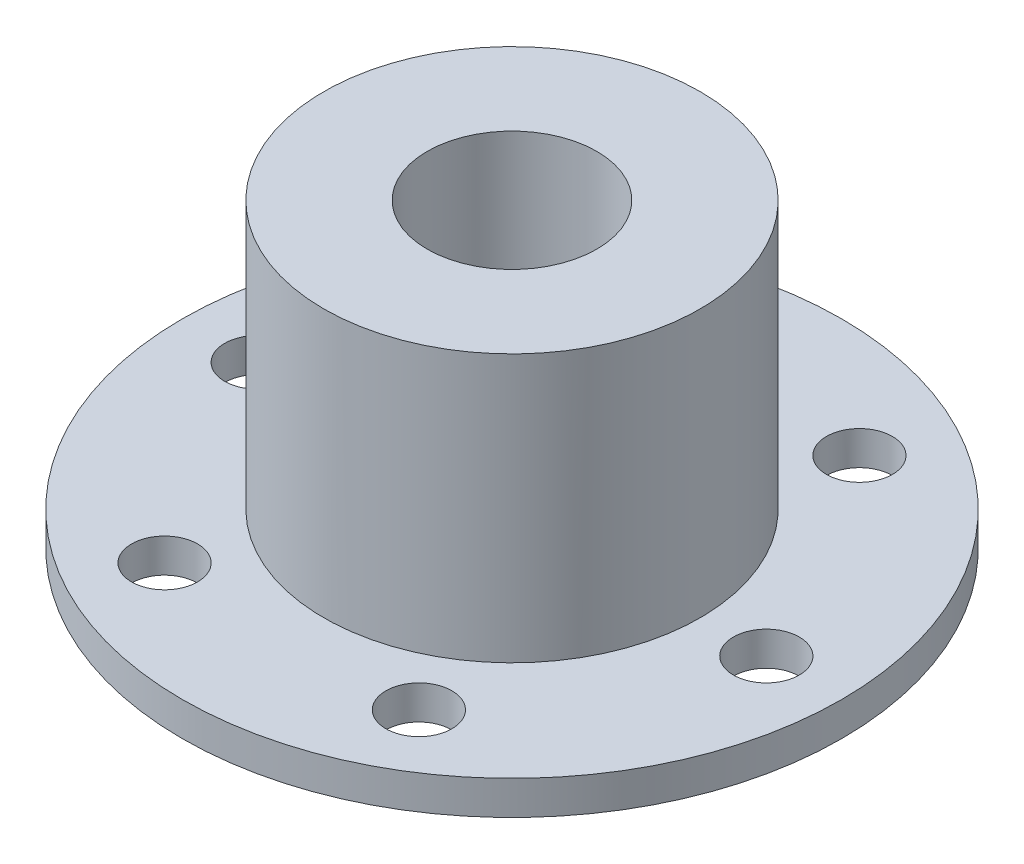
ISO-10303-21;
HEADER;
FILE_DESCRIPTION(('STEP AP214'),'2;1');
FILE_NAME('part.step','',(''),(''),'','','');
FILE_SCHEMA(('AUTOMOTIVE_DESIGN { 1 0 10303 214 1 1 1 1 }'));
ENDSEC;
DATA;
#1=APPLICATION_CONTEXT('core data for automotive mechanical design processes');
#2=APPLICATION_PROTOCOL_DEFINITION('international standard','automotive_design',2000,#1);
#3=PRODUCT_CONTEXT('',#1,'mechanical');
#4=PRODUCT('Part','Part','',(#3));
#5=PRODUCT_RELATED_PRODUCT_CATEGORY('part','',(#4));
#6=PRODUCT_DEFINITION_FORMATION('','',#4);
#7=PRODUCT_DEFINITION_CONTEXT('part definition',#1,'design');
#8=PRODUCT_DEFINITION('design','',#6,#7);
#9=PRODUCT_DEFINITION_SHAPE('','',#8);
#10=(LENGTH_UNIT() NAMED_UNIT(*) SI_UNIT(.MILLI.,.METRE.));
#11=(NAMED_UNIT(*) PLANE_ANGLE_UNIT() SI_UNIT($,.RADIAN.));
#12=(NAMED_UNIT(*) SI_UNIT($,.STERADIAN.) SOLID_ANGLE_UNIT());
#13=UNCERTAINTY_MEASURE_WITH_UNIT(LENGTH_MEASURE(1.E-05),#10,'distance_accuracy_value','');
#14=(GEOMETRIC_REPRESENTATION_CONTEXT(3) GLOBAL_UNCERTAINTY_ASSIGNED_CONTEXT((#13)) GLOBAL_UNIT_ASSIGNED_CONTEXT((#10,
#11,#12)) REPRESENTATION_CONTEXT('',''));
#15=CARTESIAN_POINT('',(0.,0.,0.));
#16=DIRECTION('',(0.,0.,1.));
#17=DIRECTION('',(1.,0.,0.));
#18=AXIS2_PLACEMENT_3D('',#15,#16,#17);
#19=CARTESIAN_POINT('',(0.,16.,0.));
#20=DIRECTION('',(0.,-1.,0.));
#21=DIRECTION('',(0.,0.,-1.));
#22=AXIS2_PLACEMENT_3D('',#19,#20,#21);
#23=CYLINDRICAL_SURFACE('',#22,9.99);
#24=CARTESIAN_POINT('',(0.,16.,0.));
#25=DIRECTION('',(0.,1.,0.));
#26=DIRECTION('',(0.,0.,1.));
#27=AXIS2_PLACEMENT_3D('',#24,#25,#26);
#28=CIRCLE('',#27,9.99);
#29=CARTESIAN_POINT('',(0.,16.,9.99));
#30=VERTEX_POINT('',#29);
#31=EDGE_CURVE('E49',#30,#30,#28,.T.);
#32=ORIENTED_EDGE('',*,*,#31,.F.);
#33=EDGE_LOOP('',(#32));
#34=FACE_BOUND('',#33,.T.);
#35=CARTESIAN_POINT('',(0.,1.8,0.));
#36=DIRECTION('',(0.,-1.,0.));
#37=DIRECTION('',(0.,0.,-1.));
#38=AXIS2_PLACEMENT_3D('',#35,#36,#37);
#39=CIRCLE('',#38,9.99);
#40=CARTESIAN_POINT('',(0.,1.8,-9.99));
#41=VERTEX_POINT('',#40);
#42=EDGE_CURVE('E10',#41,#41,#39,.T.);
#43=ORIENTED_EDGE('',*,*,#42,.F.);
#44=EDGE_LOOP('',(#43));
#45=FACE_BOUND('',#44,.T.);
#46=ADVANCED_FACE('F42',(#34,#45),#23,.T.);
#47=CARTESIAN_POINT('',(0.,16.,0.));
#48=DIRECTION('',(0.,1.,0.));
#49=DIRECTION('',(0.,0.,1.));
#50=AXIS2_PLACEMENT_3D('',#47,#48,#49);
#51=PLANE('',#50);
#52=CARTESIAN_POINT('',(0.,16.,0.));
#53=DIRECTION('',(0.,1.,0.));
#54=DIRECTION('',(0.,0.,1.));
#55=AXIS2_PLACEMENT_3D('',#52,#53,#54);
#56=CIRCLE('',#55,4.5);
#57=CARTESIAN_POINT('',(0.,16.,4.5));
#58=VERTEX_POINT('',#57);
#59=EDGE_CURVE('E64',#58,#58,#56,.F.);
#60=ORIENTED_EDGE('',*,*,#59,.T.);
#61=EDGE_LOOP('',(#60));
#62=FACE_BOUND('',#61,.T.);
#63=ORIENTED_EDGE('',*,*,#31,.T.);
#64=EDGE_LOOP('',(#63));
#65=FACE_BOUND('',#64,.T.);
#66=ADVANCED_FACE('F140',(#62,#65),#51,.T.);
#67=CARTESIAN_POINT('',(0.,1.8,0.));
#68=DIRECTION('',(0.,-1.,0.));
#69=DIRECTION('',(0.,0.,-1.));
#70=AXIS2_PLACEMENT_3D('',#67,#68,#69);
#71=CYLINDRICAL_SURFACE('',#70,17.5);
#72=CARTESIAN_POINT('',(0.,1.8,0.));
#73=DIRECTION('',(0.,-1.,0.));
#74=DIRECTION('',(0.,0.,-1.));
#75=AXIS2_PLACEMENT_3D('',#72,#73,#74);
#76=CIRCLE('',#75,17.5);
#77=CARTESIAN_POINT('',(0.,1.8,-17.5));
#78=VERTEX_POINT('',#77);
#79=EDGE_CURVE('E54',#78,#78,#76,.T.);
#80=ORIENTED_EDGE('',*,*,#79,.T.);
#81=EDGE_LOOP('',(#80));
#82=FACE_BOUND('',#81,.T.);
#83=CARTESIAN_POINT('',(0.,0.,0.));
#84=DIRECTION('',(0.,-1.,0.));
#85=DIRECTION('',(0.,0.,-1.));
#86=AXIS2_PLACEMENT_3D('',#83,#84,#85);
#87=CIRCLE('',#86,17.5);
#88=CARTESIAN_POINT('',(0.,0.,-17.5));
#89=VERTEX_POINT('',#88);
#90=EDGE_CURVE('E59',#89,#89,#87,.T.);
#91=ORIENTED_EDGE('',*,*,#90,.F.);
#92=EDGE_LOOP('',(#91));
#93=FACE_BOUND('',#92,.T.);
#94=ADVANCED_FACE('F138',(#82,#93),#71,.T.);
#95=CARTESIAN_POINT('',(0.,1.8,0.));
#96=DIRECTION('',(0.,-1.,0.));
#97=DIRECTION('',(0.,0.,-1.));
#98=AXIS2_PLACEMENT_3D('',#95,#96,#97);
#99=PLANE('',#98);
#100=CARTESIAN_POINT('',(6.75000000000014,1.8,11.6913429510898));
#101=DIRECTION('',(0.,-1.,0.));
#102=DIRECTION('',(0.,0.,-1.));
#103=AXIS2_PLACEMENT_3D('',#100,#101,#102);
#104=CIRCLE('',#103,1.75);
#105=CARTESIAN_POINT('',(6.75000000000014,1.8,9.94134295108984));
#106=VERTEX_POINT('',#105);
#107=EDGE_CURVE('E90',#106,#106,#104,.F.);
#108=ORIENTED_EDGE('',*,*,#107,.F.);
#109=EDGE_LOOP('',(#108));
#110=FACE_BOUND('',#109,.T.);
#111=CARTESIAN_POINT('',(-6.74999999999989,1.8,11.69134295109));
#112=DIRECTION('',(0.,-1.,0.));
#113=DIRECTION('',(0.,0.,-1.));
#114=AXIS2_PLACEMENT_3D('',#111,#112,#113);
#115=CIRCLE('',#114,1.75);
#116=CARTESIAN_POINT('',(-6.74999999999989,1.8,9.94134295108998));
#117=VERTEX_POINT('',#116);
#118=EDGE_CURVE('E99',#117,#117,#115,.F.);
#119=ORIENTED_EDGE('',*,*,#118,.F.);
#120=EDGE_LOOP('',(#119));
#121=FACE_BOUND('',#120,.T.);
#122=CARTESIAN_POINT('',(-13.5,1.8,0.));
#123=DIRECTION('',(0.,-1.,0.));
#124=DIRECTION('',(0.,0.,-1.));
#125=AXIS2_PLACEMENT_3D('',#122,#123,#124);
#126=CIRCLE('',#125,1.75);
#127=CARTESIAN_POINT('',(-13.5,1.8,-1.75));
#128=VERTEX_POINT('',#127);
#129=EDGE_CURVE('E107',#128,#128,#126,.F.);
#130=ORIENTED_EDGE('',*,*,#129,.F.);
#131=EDGE_LOOP('',(#130));
#132=FACE_BOUND('',#131,.T.);
#133=CARTESIAN_POINT('',(-6.75000000000006,1.8,-11.6913429510899));
#134=DIRECTION('',(0.,-1.,0.));
#135=DIRECTION('',(0.,0.,-1.));
#136=AXIS2_PLACEMENT_3D('',#133,#134,#135);
#137=CIRCLE('',#136,1.75);
#138=CARTESIAN_POINT('',(-6.75000000000006,1.8,-13.4413429510899));
#139=VERTEX_POINT('',#138);
#140=EDGE_CURVE('E89',#139,#139,#137,.F.);
#141=ORIENTED_EDGE('',*,*,#140,.F.);
#142=EDGE_LOOP('',(#141));
#143=FACE_BOUND('',#142,.T.);
#144=CARTESIAN_POINT('',(6.74999999999997,1.8,-11.6913429510899));
#145=DIRECTION('',(0.,-1.,0.));
#146=DIRECTION('',(0.,0.,-1.));
#147=AXIS2_PLACEMENT_3D('',#144,#145,#146);
#148=CIRCLE('',#147,1.75);
#149=CARTESIAN_POINT('',(6.74999999999997,1.8,-13.4413429510899));
#150=VERTEX_POINT('',#149);
#151=EDGE_CURVE('E81',#150,#150,#148,.F.);
#152=ORIENTED_EDGE('',*,*,#151,.F.);
#153=EDGE_LOOP('',(#152));
#154=FACE_BOUND('',#153,.T.);
#155=CARTESIAN_POINT('',(13.5,1.8,0.));
#156=DIRECTION('',(0.,-1.,0.));
#157=DIRECTION('',(0.,0.,-1.));
#158=AXIS2_PLACEMENT_3D('',#155,#156,#157);
#159=CIRCLE('',#158,1.75);
#160=CARTESIAN_POINT('',(13.5,1.8,-1.75));
#161=VERTEX_POINT('',#160);
#162=EDGE_CURVE('E73',#161,#161,#159,.F.);
#163=ORIENTED_EDGE('',*,*,#162,.F.);
#164=EDGE_LOOP('',(#163));
#165=FACE_BOUND('',#164,.T.);
#166=ORIENTED_EDGE('',*,*,#42,.T.);
#167=EDGE_LOOP('',(#166));
#168=FACE_BOUND('',#167,.T.);
#169=ORIENTED_EDGE('',*,*,#79,.F.);
#170=EDGE_LOOP('',(#169));
#171=FACE_BOUND('',#170,.T.);
#172=ADVANCED_FACE('F128',(#110,#121,#132,#143,#154,#165,#168,#171),#99,.F.);
#173=CARTESIAN_POINT('',(0.,0.,0.));
#174=DIRECTION('',(0.,1.,0.));
#175=DIRECTION('',(0.,0.,1.));
#176=AXIS2_PLACEMENT_3D('',#173,#174,#175);
#177=PLANE('',#176);
#178=CARTESIAN_POINT('',(6.75000000000014,0.,11.6913429510898));
#179=DIRECTION('',(0.,-1.,0.));
#180=DIRECTION('',(0.866025403784433,0.,-0.50000000000001));
#181=AXIS2_PLACEMENT_3D('',#178,#179,#180);
#182=CIRCLE('',#181,1.75);
#183=CARTESIAN_POINT('',(8.26554445662289,0.,10.8163429510898));
#184=VERTEX_POINT('',#183);
#185=EDGE_CURVE('E95',#184,#184,#182,.T.);
#186=ORIENTED_EDGE('',*,*,#185,.F.);
#187=EDGE_LOOP('',(#186));
#188=FACE_BOUND('',#187,.T.);
#189=CARTESIAN_POINT('',(-6.74999999999989,0.,11.69134295109));
#190=DIRECTION('',(0.,-1.,0.));
#191=DIRECTION('',(0.866025403784443,0.,0.499999999999992));
#192=AXIS2_PLACEMENT_3D('',#189,#190,#191);
#193=CIRCLE('',#192,1.75);
#194=CARTESIAN_POINT('',(-5.23445554337712,0.,12.56634295109));
#195=VERTEX_POINT('',#194);
#196=EDGE_CURVE('E94',#195,#195,#193,.T.);
#197=ORIENTED_EDGE('',*,*,#196,.F.);
#198=EDGE_LOOP('',(#197));
#199=FACE_BOUND('',#198,.T.);
#200=CARTESIAN_POINT('',(-13.5,0.,0.));
#201=DIRECTION('',(0.,-1.,0.));
#202=DIRECTION('',(0.,0.,1.));
#203=AXIS2_PLACEMENT_3D('',#200,#201,#202);
#204=CIRCLE('',#203,1.75);
#205=CARTESIAN_POINT('',(-13.5,0.,1.75));
#206=VERTEX_POINT('',#205);
#207=EDGE_CURVE('E103',#206,#206,#204,.T.);
#208=ORIENTED_EDGE('',*,*,#207,.F.);
#209=EDGE_LOOP('',(#208));
#210=FACE_BOUND('',#209,.T.);
#211=CARTESIAN_POINT('',(-6.75000000000006,0.,-11.6913429510899));
#212=DIRECTION('',(0.,-1.,0.));
#213=DIRECTION('',(-0.866025403784436,0.,0.500000000000004));
#214=AXIS2_PLACEMENT_3D('',#211,#212,#213);
#215=CIRCLE('',#214,1.75);
#216=CARTESIAN_POINT('',(-8.26554445662282,0.,-10.8163429510899));
#217=VERTEX_POINT('',#216);
#218=EDGE_CURVE('E111',#217,#217,#215,.T.);
#219=ORIENTED_EDGE('',*,*,#218,.F.);
#220=EDGE_LOOP('',(#219));
#221=FACE_BOUND('',#220,.T.);
#222=CARTESIAN_POINT('',(6.74999999999997,0.,-11.6913429510899));
#223=DIRECTION('',(0.,-1.,0.));
#224=DIRECTION('',(-0.86602540378444,0.,-0.499999999999998));
#225=AXIS2_PLACEMENT_3D('',#222,#223,#224);
#226=CIRCLE('',#225,1.75);
#227=CARTESIAN_POINT('',(5.2344555433772,0.,-12.5663429510899));
#228=VERTEX_POINT('',#227);
#229=EDGE_CURVE('E85',#228,#228,#226,.T.);
#230=ORIENTED_EDGE('',*,*,#229,.F.);
#231=EDGE_LOOP('',(#230));
#232=FACE_BOUND('',#231,.T.);
#233=CARTESIAN_POINT('',(13.5,0.,0.));
#234=DIRECTION('',(0.,-1.,0.));
#235=DIRECTION('',(0.,0.,-1.));
#236=AXIS2_PLACEMENT_3D('',#233,#234,#235);
#237=CIRCLE('',#236,1.75);
#238=CARTESIAN_POINT('',(13.5,0.,-1.75));
#239=VERTEX_POINT('',#238);
#240=EDGE_CURVE('E77',#239,#239,#237,.T.);
#241=ORIENTED_EDGE('',*,*,#240,.F.);
#242=EDGE_LOOP('',(#241));
#243=FACE_BOUND('',#242,.T.);
#244=CARTESIAN_POINT('',(0.,0.,0.));
#245=DIRECTION('',(0.,-1.,0.));
#246=DIRECTION('',(0.,0.,-1.));
#247=AXIS2_PLACEMENT_3D('',#244,#245,#246);
#248=CIRCLE('',#247,4.5);
#249=CARTESIAN_POINT('',(0.,0.,-4.5));
#250=VERTEX_POINT('',#249);
#251=EDGE_CURVE('E69',#250,#250,#248,.T.);
#252=ORIENTED_EDGE('',*,*,#251,.F.);
#253=EDGE_LOOP('',(#252));
#254=FACE_BOUND('',#253,.T.);
#255=ORIENTED_EDGE('',*,*,#90,.T.);
#256=EDGE_LOOP('',(#255));
#257=FACE_BOUND('',#256,.T.);
#258=ADVANCED_FACE('F124',(#188,#199,#210,#221,#232,#243,#254,#257),#177,.F.);
#259=CARTESIAN_POINT('',(0.,28.7279220613579,0.));
#260=DIRECTION('',(0.,-1.,0.));
#261=DIRECTION('',(0.,0.,-1.));
#262=AXIS2_PLACEMENT_3D('',#259,#260,#261);
#263=CYLINDRICAL_SURFACE('',#262,4.5);
#264=ORIENTED_EDGE('',*,*,#251,.T.);
#265=EDGE_LOOP('',(#264));
#266=FACE_BOUND('',#265,.T.);
#267=ORIENTED_EDGE('',*,*,#59,.F.);
#268=EDGE_LOOP('',(#267));
#269=FACE_BOUND('',#268,.T.);
#270=ADVANCED_FACE('F127',(#266,#269),#263,.F.);
#271=CARTESIAN_POINT('',(13.5,6.74974746830583,0.));
#272=DIRECTION('',(0.,-1.,0.));
#273=DIRECTION('',(0.,0.,-1.));
#274=AXIS2_PLACEMENT_3D('',#271,#272,#273);
#275=CYLINDRICAL_SURFACE('',#274,1.75);
#276=ORIENTED_EDGE('',*,*,#162,.T.);
#277=EDGE_LOOP('',(#276));
#278=FACE_BOUND('',#277,.T.);
#279=ORIENTED_EDGE('',*,*,#240,.T.);
#280=EDGE_LOOP('',(#279));
#281=FACE_BOUND('',#280,.T.);
#282=ADVANCED_FACE('F179',(#278,#281),#275,.F.);
#283=CARTESIAN_POINT('',(6.74999999999997,6.74974746830583,-11.6913429510899));
#284=DIRECTION('',(0.,-1.,0.));
#285=DIRECTION('',(0.,0.,-1.));
#286=AXIS2_PLACEMENT_3D('',#283,#284,#285);
#287=CYLINDRICAL_SURFACE('',#286,1.75);
#288=ORIENTED_EDGE('',*,*,#151,.T.);
#289=EDGE_LOOP('',(#288));
#290=FACE_BOUND('',#289,.T.);
#291=ORIENTED_EDGE('',*,*,#229,.T.);
#292=EDGE_LOOP('',(#291));
#293=FACE_BOUND('',#292,.T.);
#294=ADVANCED_FACE('F188',(#290,#293),#287,.F.);
#295=CARTESIAN_POINT('',(-6.75000000000006,6.74974746830583,-11.6913429510899));
#296=DIRECTION('',(0.,-1.,0.));
#297=DIRECTION('',(0.,0.,-1.));
#298=AXIS2_PLACEMENT_3D('',#295,#296,#297);
#299=CYLINDRICAL_SURFACE('',#298,1.75);
#300=ORIENTED_EDGE('',*,*,#140,.T.);
#301=EDGE_LOOP('',(#300));
#302=FACE_BOUND('',#301,.T.);
#303=ORIENTED_EDGE('',*,*,#218,.T.);
#304=EDGE_LOOP('',(#303));
#305=FACE_BOUND('',#304,.T.);
#306=ADVANCED_FACE('F122',(#302,#305),#299,.F.);
#307=CARTESIAN_POINT('',(-13.5,6.74974746830583,0.));
#308=DIRECTION('',(0.,-1.,0.));
#309=DIRECTION('',(0.,0.,-1.));
#310=AXIS2_PLACEMENT_3D('',#307,#308,#309);
#311=CYLINDRICAL_SURFACE('',#310,1.75);
#312=ORIENTED_EDGE('',*,*,#129,.T.);
#313=EDGE_LOOP('',(#312));
#314=FACE_BOUND('',#313,.T.);
#315=ORIENTED_EDGE('',*,*,#207,.T.);
#316=EDGE_LOOP('',(#315));
#317=FACE_BOUND('',#316,.T.);
#318=ADVANCED_FACE('F205',(#314,#317),#311,.F.);
#319=CARTESIAN_POINT('',(-6.74999999999989,6.74974746830583,11.69134295109));
#320=DIRECTION('',(0.,-1.,0.));
#321=DIRECTION('',(0.,0.,-1.));
#322=AXIS2_PLACEMENT_3D('',#319,#320,#321);
#323=CYLINDRICAL_SURFACE('',#322,1.75);
#324=ORIENTED_EDGE('',*,*,#118,.T.);
#325=EDGE_LOOP('',(#324));
#326=FACE_BOUND('',#325,.T.);
#327=ORIENTED_EDGE('',*,*,#196,.T.);
#328=EDGE_LOOP('',(#327));
#329=FACE_BOUND('',#328,.T.);
#330=ADVANCED_FACE('F214',(#326,#329),#323,.F.);
#331=CARTESIAN_POINT('',(6.75000000000014,6.74974746830583,11.6913429510898));
#332=DIRECTION('',(0.,-1.,0.));
#333=DIRECTION('',(0.,0.,-1.));
#334=AXIS2_PLACEMENT_3D('',#331,#332,#333);
#335=CYLINDRICAL_SURFACE('',#334,1.75);
#336=ORIENTED_EDGE('',*,*,#107,.T.);
#337=EDGE_LOOP('',(#336));
#338=FACE_BOUND('',#337,.T.);
#339=ORIENTED_EDGE('',*,*,#185,.T.);
#340=EDGE_LOOP('',(#339));
#341=FACE_BOUND('',#340,.T.);
#342=ADVANCED_FACE('F223',(#338,#341),#335,.F.);
#343=CLOSED_SHELL('',(#46,#66,#94,#172,#258,#270,#282,#294,#306,#318,#330,#342));
#344=MANIFOLD_SOLID_BREP('B2',#343);
#345=ADVANCED_BREP_SHAPE_REPRESENTATION('',(#18,#344),#14);
#346=SHAPE_DEFINITION_REPRESENTATION(#9,#345);
ENDSEC;
END-ISO-10303-21;
